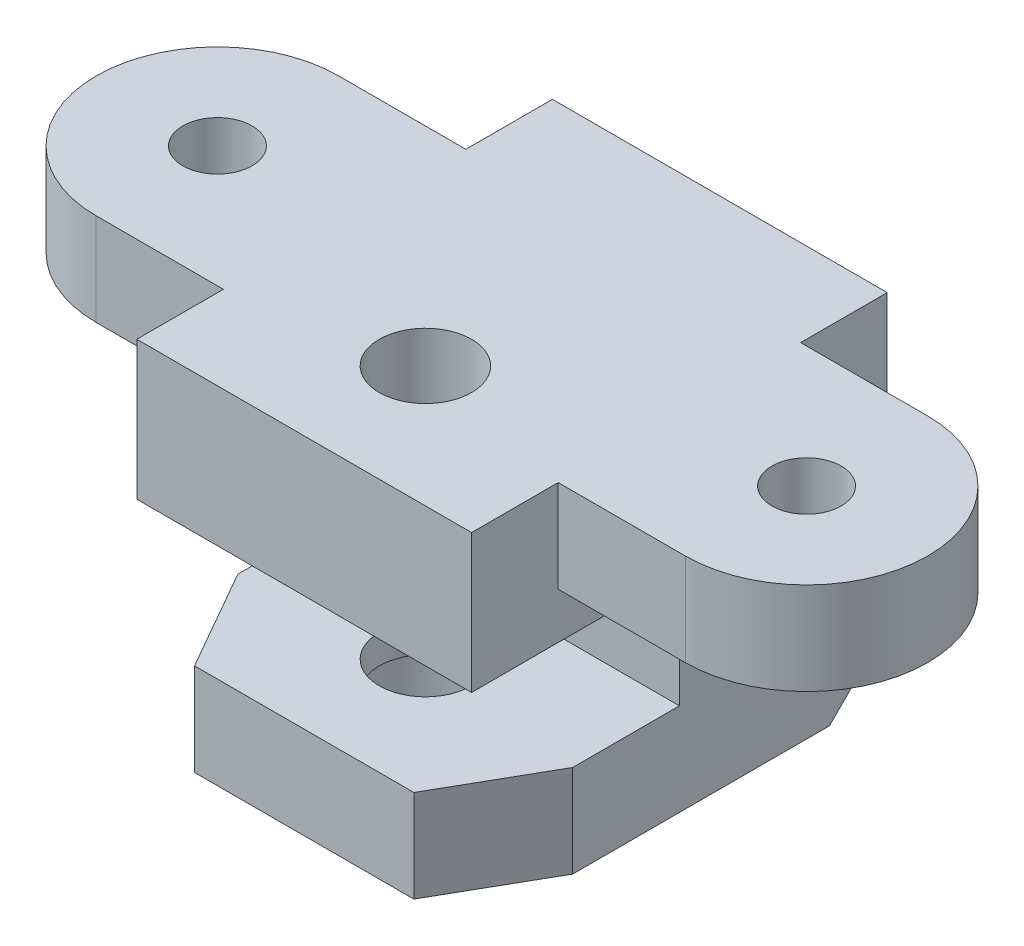
ISO-10303-21;
HEADER;
FILE_DESCRIPTION(('STEP AP214'),'2;1');
FILE_NAME('part.step','',(''),(''),'','','');
FILE_SCHEMA(('AUTOMOTIVE_DESIGN { 1 0 10303 214 1 1 1 1 }'));
ENDSEC;
DATA;
#1=APPLICATION_CONTEXT('core data for automotive mechanical design processes');
#2=APPLICATION_PROTOCOL_DEFINITION('international standard','automotive_design',2000,#1);
#3=PRODUCT_CONTEXT('',#1,'mechanical');
#4=PRODUCT('Part','Part','',(#3));
#5=PRODUCT_RELATED_PRODUCT_CATEGORY('part','',(#4));
#6=PRODUCT_DEFINITION_FORMATION('','',#4);
#7=PRODUCT_DEFINITION_CONTEXT('part definition',#1,'design');
#8=PRODUCT_DEFINITION('design','',#6,#7);
#9=PRODUCT_DEFINITION_SHAPE('','',#8);
#10=(LENGTH_UNIT() NAMED_UNIT(*) SI_UNIT(.MILLI.,.METRE.));
#11=(NAMED_UNIT(*) PLANE_ANGLE_UNIT() SI_UNIT($,.RADIAN.));
#12=(NAMED_UNIT(*) SI_UNIT($,.STERADIAN.) SOLID_ANGLE_UNIT());
#13=UNCERTAINTY_MEASURE_WITH_UNIT(LENGTH_MEASURE(1.E-05),#10,'distance_accuracy_value','');
#14=(GEOMETRIC_REPRESENTATION_CONTEXT(3) GLOBAL_UNCERTAINTY_ASSIGNED_CONTEXT((#13)) GLOBAL_UNIT_ASSIGNED_CONTEXT((#10,
#11,#12)) REPRESENTATION_CONTEXT('',''));
#15=CARTESIAN_POINT('',(0.,0.,0.));
#16=DIRECTION('',(0.,0.,1.));
#17=DIRECTION('',(1.,0.,0.));
#18=AXIS2_PLACEMENT_3D('',#15,#16,#17);
#19=CARTESIAN_POINT('',(0.,-120.,30.));
#20=DIRECTION('',(0.,1.,0.));
#21=DIRECTION('',(0.,0.,1.));
#22=AXIS2_PLACEMENT_3D('',#19,#20,#21);
#23=CYLINDRICAL_SURFACE('',#22,16.);
#24=CARTESIAN_POINT('',(0.,-88.,30.));
#25=DIRECTION('',(0.,-1.,0.));
#26=DIRECTION('',(0.,0.,-1.));
#27=AXIS2_PLACEMENT_3D('',#24,#25,#26);
#28=CIRCLE('',#27,16.);
#29=CARTESIAN_POINT('',(0.,-88.,14.));
#30=VERTEX_POINT('',#29);
#31=EDGE_CURVE('E195',#30,#30,#28,.T.);
#32=ORIENTED_EDGE('',*,*,#31,.F.);
#33=EDGE_LOOP('',(#32));
#34=FACE_BOUND('',#33,.T.);
#35=CARTESIAN_POINT('',(0.,-98.,30.));
#36=DIRECTION('',(0.,-1.,0.));
#37=DIRECTION('',(0.,0.,-1.));
#38=AXIS2_PLACEMENT_3D('',#35,#36,#37);
#39=CIRCLE('',#38,16.);
#40=CARTESIAN_POINT('',(0.,-98.,14.));
#41=VERTEX_POINT('',#40);
#42=EDGE_CURVE('E49',#41,#41,#39,.F.);
#43=ORIENTED_EDGE('',*,*,#42,.F.);
#44=EDGE_LOOP('',(#43));
#45=FACE_BOUND('',#44,.T.);
#46=ADVANCED_FACE('F45',(#34,#45),#23,.F.);
#47=CARTESIAN_POINT('',(-58.,-120.,72.));
#48=DIRECTION('',(0.,0.,1.));
#49=DIRECTION('',(1.,0.,0.));
#50=AXIS2_PLACEMENT_3D('',#47,#48,#49);
#51=PLANE('',#50);
#52=DIRECTION('',(1.,0.,0.));
#53=VECTOR('',#52,1.);
#54=CARTESIAN_POINT('',(-58.,-120.,72.));
#55=LINE('',#54,#53);
#56=CARTESIAN_POINT('',(-38.,-120.,72.));
#57=VERTEX_POINT('',#56);
#58=CARTESIAN_POINT('',(38.,-120.,72.));
#59=VERTEX_POINT('',#58);
#60=EDGE_CURVE('E412',#57,#59,#55,.T.);
#61=ORIENTED_EDGE('',*,*,#60,.T.);
#62=DIRECTION('',(0.,-1.,0.));
#63=VECTOR('',#62,1.);
#64=CARTESIAN_POINT('',(38.,0.001000000000001,72.));
#65=LINE('',#64,#63);
#66=CARTESIAN_POINT('',(38.,-88.,72.));
#67=VERTEX_POINT('',#66);
#68=EDGE_CURVE('E184',#67,#59,#65,.T.);
#69=ORIENTED_EDGE('',*,*,#68,.F.);
#70=DIRECTION('',(-1.,0.,0.));
#71=VECTOR('',#70,1.);
#72=CARTESIAN_POINT('',(58.,-88.,72.));
#73=LINE('',#72,#71);
#74=CARTESIAN_POINT('',(-38.,-88.,72.));
#75=VERTEX_POINT('',#74);
#76=EDGE_CURVE('E355',#67,#75,#73,.T.);
#77=ORIENTED_EDGE('',*,*,#76,.T.);
#78=DIRECTION('',(0.,-1.,0.));
#79=VECTOR('',#78,1.);
#80=CARTESIAN_POINT('',(-38.,0.001000000000001,72.));
#81=LINE('',#80,#79);
#82=EDGE_CURVE('E324',#75,#57,#81,.T.);
#83=ORIENTED_EDGE('',*,*,#82,.T.);
#84=EDGE_LOOP('',(#61,#69,#77,#83));
#85=FACE_BOUND('',#84,.T.);
#86=ADVANCED_FACE('F494',(#85),#51,.T.);
#87=CARTESIAN_POINT('',(58.,-120.,72.));
#88=DIRECTION('',(1.,0.,0.));
#89=DIRECTION('',(0.,0.,-1.));
#90=AXIS2_PLACEMENT_3D('',#87,#88,#89);
#91=PLANE('',#90);
#92=DIRECTION('',(0.,0.707106781186548,-0.707106781186548));
#93=VECTOR('',#92,1.);
#94=CARTESIAN_POINT('',(58.,-100.,-72.));
#95=LINE('',#94,#93);
#96=CARTESIAN_POINT('',(58.,-120.,-52.));
#97=VERTEX_POINT('',#96);
#98=CARTESIAN_POINT('',(58.,-100.,-72.));
#99=VERTEX_POINT('',#98);
#100=EDGE_CURVE('E178',#97,#99,#95,.T.);
#101=ORIENTED_EDGE('',*,*,#100,.T.);
#102=DIRECTION('',(0.,1.,0.));
#103=VECTOR('',#102,1.);
#104=CARTESIAN_POINT('',(58.,-120.,-72.));
#105=LINE('',#104,#103);
#106=CARTESIAN_POINT('',(58.,0.,-72.));
#107=VERTEX_POINT('',#106);
#108=EDGE_CURVE('E11',#99,#107,#105,.T.);
#109=ORIENTED_EDGE('',*,*,#108,.T.);
#110=DIRECTION('',(0.,0.,-1.));
#111=VECTOR('',#110,1.);
#112=CARTESIAN_POINT('',(58.,0.,72.));
#113=LINE('',#112,#111);
#114=CARTESIAN_POINT('',(58.,0.,-42.));
#115=VERTEX_POINT('',#114);
#116=EDGE_CURVE('E205',#115,#107,#113,.T.);
#117=ORIENTED_EDGE('',*,*,#116,.F.);
#118=DIRECTION('',(0.,1.,0.));
#119=VECTOR('',#118,1.);
#120=CARTESIAN_POINT('',(58.,-32.,-42.));
#121=LINE('',#120,#119);
#122=CARTESIAN_POINT('',(58.,-32.,-42.));
#123=VERTEX_POINT('',#122);
#124=EDGE_CURVE('E302',#123,#115,#121,.T.);
#125=ORIENTED_EDGE('',*,*,#124,.F.);
#126=DIRECTION('',(0.,0.,-1.));
#127=VECTOR('',#126,1.);
#128=CARTESIAN_POINT('',(58.,-32.,-42.));
#129=LINE('',#128,#127);
#130=CARTESIAN_POINT('',(58.,-32.,42.));
#131=VERTEX_POINT('',#130);
#132=EDGE_CURVE('E280',#131,#123,#129,.T.);
#133=ORIENTED_EDGE('',*,*,#132,.F.);
#134=DIRECTION('',(0.,1.,0.));
#135=VECTOR('',#134,1.);
#136=CARTESIAN_POINT('',(58.,-32.,42.));
#137=LINE('',#136,#135);
#138=CARTESIAN_POINT('',(58.,0.,42.));
#139=VERTEX_POINT('',#138);
#140=EDGE_CURVE('E294',#131,#139,#137,.T.);
#141=ORIENTED_EDGE('',*,*,#140,.T.);
#142=CARTESIAN_POINT('',(58.,0.,72.));
#143=VERTEX_POINT('',#142);
#144=EDGE_CURVE('E210',#143,#139,#113,.T.);
#145=ORIENTED_EDGE('',*,*,#144,.F.);
#146=DIRECTION('',(0.,1.,0.));
#147=VECTOR('',#146,1.);
#148=CARTESIAN_POINT('',(58.,-120.,72.));
#149=LINE('',#148,#147);
#150=CARTESIAN_POINT('',(58.,-48.,72.));
#151=VERTEX_POINT('',#150);
#152=EDGE_CURVE('E55',#151,#143,#149,.T.);
#153=ORIENTED_EDGE('',*,*,#152,.F.);
#154=DIRECTION('',(0.,0.,-1.));
#155=VECTOR('',#154,1.);
#156=CARTESIAN_POINT('',(58.,-48.,72.));
#157=LINE('',#156,#155);
#158=CARTESIAN_POINT('',(58.,-48.,0.));
#159=VERTEX_POINT('',#158);
#160=EDGE_CURVE('E331',#151,#159,#157,.T.);
#161=ORIENTED_EDGE('',*,*,#160,.T.);
#162=DIRECTION('',(0.,-1.,0.));
#163=VECTOR('',#162,1.);
#164=CARTESIAN_POINT('',(58.,-48.,0.));
#165=LINE('',#164,#163);
#166=CARTESIAN_POINT('',(58.,-88.,0.));
#167=VERTEX_POINT('',#166);
#168=EDGE_CURVE('E335',#159,#167,#165,.T.);
#169=ORIENTED_EDGE('',*,*,#168,.T.);
#170=DIRECTION('',(0.,0.,1.));
#171=VECTOR('',#170,1.);
#172=CARTESIAN_POINT('',(58.,-88.,0.));
#173=LINE('',#172,#171);
#174=CARTESIAN_POINT('',(58.,-88.,37.));
#175=VERTEX_POINT('',#174);
#176=EDGE_CURVE('E340',#167,#175,#173,.T.);
#177=ORIENTED_EDGE('',*,*,#176,.T.);
#178=DIRECTION('',(0.,-1.,0.));
#179=VECTOR('',#178,1.);
#180=CARTESIAN_POINT('',(58.,0.001000000000001,37.));
#181=LINE('',#180,#179);
#182=CARTESIAN_POINT('',(58.,-120.,37.));
#183=VERTEX_POINT('',#182);
#184=EDGE_CURVE('E71',#175,#183,#181,.T.);
#185=ORIENTED_EDGE('',*,*,#184,.T.);
#186=DIRECTION('',(0.,0.,-1.));
#187=VECTOR('',#186,1.);
#188=CARTESIAN_POINT('',(58.,-120.,72.));
#189=LINE('',#188,#187);
#190=EDGE_CURVE('E193',#183,#97,#189,.T.);
#191=ORIENTED_EDGE('',*,*,#190,.T.);
#192=EDGE_LOOP('',(#101,#109,#117,#125,#133,#141,#145,#153,#161,#169,#177,#185,#191));
#193=FACE_BOUND('',#192,.T.);
#194=ADVANCED_FACE('F189',(#193),#91,.T.);
#195=CARTESIAN_POINT('',(0.,-120.,0.));
#196=DIRECTION('',(0.,1.,0.));
#197=DIRECTION('',(0.,0.,1.));
#198=AXIS2_PLACEMENT_3D('',#195,#196,#197);
#199=PLANE('',#198);
#200=CARTESIAN_POINT('',(0.,-120.,30.));
#201=DIRECTION('',(0.,-1.,0.));
#202=DIRECTION('',(0.,0.,-1.));
#203=AXIS2_PLACEMENT_3D('',#200,#201,#202);
#204=CIRCLE('',#203,27.);
#205=CARTESIAN_POINT('',(0.,-120.,2.99999999999999));
#206=VERTEX_POINT('',#205);
#207=EDGE_CURVE('E253',#206,#206,#204,.T.);
#208=ORIENTED_EDGE('',*,*,#207,.F.);
#209=EDGE_LOOP('',(#208));
#210=FACE_BOUND('',#209,.T.);
#211=DIRECTION('',(0.,0.,-1.));
#212=VECTOR('',#211,1.);
#213=CARTESIAN_POINT('',(-58.,-120.,72.));
#214=LINE('',#213,#212);
#215=CARTESIAN_POINT('',(-58.,-120.,37.));
#216=VERTEX_POINT('',#215);
#217=CARTESIAN_POINT('',(-58.,-120.,-52.));
#218=VERTEX_POINT('',#217);
#219=EDGE_CURVE('E215',#216,#218,#214,.T.);
#220=ORIENTED_EDGE('',*,*,#219,.T.);
#221=DIRECTION('',(-1.,0.,0.));
#222=VECTOR('',#221,1.);
#223=CARTESIAN_POINT('',(144.070345964171,-120.,-52.));
#224=LINE('',#223,#222);
#225=EDGE_CURVE('E185',#97,#218,#224,.T.);
#226=ORIENTED_EDGE('',*,*,#225,.F.);
#227=ORIENTED_EDGE('',*,*,#190,.F.);
#228=DIRECTION('',(-0.496138938356834,0.,0.868243142124459));
#229=VECTOR('',#228,1.);
#230=CARTESIAN_POINT('',(38.,-120.,72.));
#231=LINE('',#230,#229);
#232=EDGE_CURVE('E263',#183,#59,#231,.T.);
#233=ORIENTED_EDGE('',*,*,#232,.T.);
#234=ORIENTED_EDGE('',*,*,#60,.F.);
#235=DIRECTION('',(0.496138938356834,0.,0.868243142124459));
#236=VECTOR('',#235,1.);
#237=CARTESIAN_POINT('',(-38.,-120.,72.));
#238=LINE('',#237,#236);
#239=EDGE_CURVE('E320',#216,#57,#238,.T.);
#240=ORIENTED_EDGE('',*,*,#239,.F.);
#241=EDGE_LOOP('',(#220,#226,#227,#233,#234,#240));
#242=FACE_BOUND('',#241,.T.);
#243=ADVANCED_FACE('F423',(#210,#242),#199,.F.);
#244=CARTESIAN_POINT('',(58.,-88.,0.));
#245=DIRECTION('',(0.,-1.,0.));
#246=DIRECTION('',(0.,0.,-1.));
#247=AXIS2_PLACEMENT_3D('',#244,#245,#246);
#248=PLANE('',#247);
#249=ORIENTED_EDGE('',*,*,#31,.T.);
#250=EDGE_LOOP('',(#249));
#251=FACE_BOUND('',#250,.T.);
#252=DIRECTION('',(0.496138938356834,0.,-0.868243142124459));
#253=VECTOR('',#252,1.);
#254=CARTESIAN_POINT('',(38.,-88.,72.));
#255=LINE('',#254,#253);
#256=EDGE_CURVE('E260',#67,#175,#255,.T.);
#257=ORIENTED_EDGE('',*,*,#256,.T.);
#258=ORIENTED_EDGE('',*,*,#176,.F.);
#259=DIRECTION('',(-1.,0.,0.));
#260=VECTOR('',#259,1.);
#261=CARTESIAN_POINT('',(58.,-88.,0.));
#262=LINE('',#261,#260);
#263=CARTESIAN_POINT('',(-58.,-88.,0.));
#264=VERTEX_POINT('',#263);
#265=EDGE_CURVE('E359',#167,#264,#262,.T.);
#266=ORIENTED_EDGE('',*,*,#265,.T.);
#267=DIRECTION('',(0.,0.,1.));
#268=VECTOR('',#267,1.);
#269=CARTESIAN_POINT('',(-58.,-88.,0.));
#270=LINE('',#269,#268);
#271=CARTESIAN_POINT('',(-58.,-88.,37.));
#272=VERTEX_POINT('',#271);
#273=EDGE_CURVE('E336',#264,#272,#270,.T.);
#274=ORIENTED_EDGE('',*,*,#273,.T.);
#275=DIRECTION('',(-0.496138938356834,0.,-0.868243142124459));
#276=VECTOR('',#275,1.);
#277=CARTESIAN_POINT('',(-38.,-88.,72.));
#278=LINE('',#277,#276);
#279=EDGE_CURVE('E306',#75,#272,#278,.T.);
#280=ORIENTED_EDGE('',*,*,#279,.F.);
#281=ORIENTED_EDGE('',*,*,#76,.F.);
#282=EDGE_LOOP('',(#257,#258,#266,#274,#280,#281));
#283=FACE_BOUND('',#282,.T.);
#284=ADVANCED_FACE('F535',(#251,#283),#248,.F.);
#285=CARTESIAN_POINT('',(-58.,-120.,72.));
#286=DIRECTION('',(1.,0.,0.));
#287=DIRECTION('',(0.,0.,-1.));
#288=AXIS2_PLACEMENT_3D('',#285,#286,#287);
#289=PLANE('',#288);
#290=DIRECTION('',(0.,1.,0.));
#291=VECTOR('',#290,1.);
#292=CARTESIAN_POINT('',(-58.,-120.,-72.));
#293=LINE('',#292,#291);
#294=CARTESIAN_POINT('',(-58.,-100.,-72.));
#295=VERTEX_POINT('',#294);
#296=CARTESIAN_POINT('',(-58.,0.,-72.));
#297=VERTEX_POINT('',#296);
#298=EDGE_CURVE('E200',#295,#297,#293,.T.);
#299=ORIENTED_EDGE('',*,*,#298,.F.);
#300=DIRECTION('',(0.,0.707106781186548,-0.707106781186548));
#301=VECTOR('',#300,1.);
#302=CARTESIAN_POINT('',(-58.,-100.,-72.));
#303=LINE('',#302,#301);
#304=EDGE_CURVE('E63',#218,#295,#303,.T.);
#305=ORIENTED_EDGE('',*,*,#304,.F.);
#306=ORIENTED_EDGE('',*,*,#219,.F.);
#307=DIRECTION('',(0.,-1.,0.));
#308=VECTOR('',#307,1.);
#309=CARTESIAN_POINT('',(-58.,0.001000000000001,37.));
#310=LINE('',#309,#308);
#311=EDGE_CURVE('E323',#272,#216,#310,.T.);
#312=ORIENTED_EDGE('',*,*,#311,.F.);
#313=ORIENTED_EDGE('',*,*,#273,.F.);
#314=DIRECTION('',(0.,-1.,0.));
#315=VECTOR('',#314,1.);
#316=CARTESIAN_POINT('',(-58.,-48.,0.));
#317=LINE('',#316,#315);
#318=CARTESIAN_POINT('',(-58.,-48.,0.));
#319=VERTEX_POINT('',#318);
#320=EDGE_CURVE('E348',#319,#264,#317,.T.);
#321=ORIENTED_EDGE('',*,*,#320,.F.);
#322=DIRECTION('',(0.,0.,-1.));
#323=VECTOR('',#322,1.);
#324=CARTESIAN_POINT('',(-58.,-48.,72.));
#325=LINE('',#324,#323);
#326=CARTESIAN_POINT('',(-58.,-48.,72.));
#327=VERTEX_POINT('',#326);
#328=EDGE_CURVE('E328',#327,#319,#325,.T.);
#329=ORIENTED_EDGE('',*,*,#328,.F.);
#330=DIRECTION('',(0.,1.,0.));
#331=VECTOR('',#330,1.);
#332=CARTESIAN_POINT('',(-58.,-120.,72.));
#333=LINE('',#332,#331);
#334=CARTESIAN_POINT('',(-58.,0.,72.));
#335=VERTEX_POINT('',#334);
#336=EDGE_CURVE('E231',#327,#335,#333,.T.);
#337=ORIENTED_EDGE('',*,*,#336,.T.);
#338=DIRECTION('',(0.,0.,-1.));
#339=VECTOR('',#338,1.);
#340=CARTESIAN_POINT('',(-58.,0.,72.));
#341=LINE('',#340,#339);
#342=CARTESIAN_POINT('',(-58.,0.,42.));
#343=VERTEX_POINT('',#342);
#344=EDGE_CURVE('E225',#335,#343,#341,.T.);
#345=ORIENTED_EDGE('',*,*,#344,.T.);
#346=DIRECTION('',(0.,1.,0.));
#347=VECTOR('',#346,1.);
#348=CARTESIAN_POINT('',(-58.,-32.,42.));
#349=LINE('',#348,#347);
#350=CARTESIAN_POINT('',(-58.,-32.,42.));
#351=VERTEX_POINT('',#350);
#352=EDGE_CURVE('E206',#351,#343,#349,.T.);
#353=ORIENTED_EDGE('',*,*,#352,.F.);
#354=DIRECTION('',(0.,0.,-1.));
#355=VECTOR('',#354,1.);
#356=CARTESIAN_POINT('',(-58.,-32.,-42.));
#357=LINE('',#356,#355);
#358=CARTESIAN_POINT('',(-58.,-32.,-42.));
#359=VERTEX_POINT('',#358);
#360=EDGE_CURVE('E375',#351,#359,#357,.T.);
#361=ORIENTED_EDGE('',*,*,#360,.T.);
#362=DIRECTION('',(0.,1.,0.));
#363=VECTOR('',#362,1.);
#364=CARTESIAN_POINT('',(-58.,-32.,-42.));
#365=LINE('',#364,#363);
#366=CARTESIAN_POINT('',(-58.,0.,-42.));
#367=VERTEX_POINT('',#366);
#368=EDGE_CURVE('E392',#359,#367,#365,.T.);
#369=ORIENTED_EDGE('',*,*,#368,.T.);
#370=EDGE_CURVE('E224',#367,#297,#341,.T.);
#371=ORIENTED_EDGE('',*,*,#370,.T.);
#372=EDGE_LOOP('',(#299,#305,#306,#312,#313,#321,#329,#337,#345,#353,#361,#369,#371));
#373=FACE_BOUND('',#372,.T.);
#374=ADVANCED_FACE('F426',(#373),#289,.F.);
#375=CARTESIAN_POINT('',(-58.,-120.,-72.));
#376=DIRECTION('',(0.,0.,1.));
#377=DIRECTION('',(1.,0.,0.));
#378=AXIS2_PLACEMENT_3D('',#375,#376,#377);
#379=PLANE('',#378);
#380=ORIENTED_EDGE('',*,*,#108,.F.);
#381=DIRECTION('',(-1.,0.,0.));
#382=VECTOR('',#381,1.);
#383=CARTESIAN_POINT('',(144.070345964171,-100.,-72.));
#384=LINE('',#383,#382);
#385=EDGE_CURVE('E175',#99,#295,#384,.T.);
#386=ORIENTED_EDGE('',*,*,#385,.T.);
#387=ORIENTED_EDGE('',*,*,#298,.T.);
#388=DIRECTION('',(1.,0.,0.));
#389=VECTOR('',#388,1.);
#390=CARTESIAN_POINT('',(-58.,0.,-72.));
#391=LINE('',#390,#389);
#392=EDGE_CURVE('E199',#297,#107,#391,.T.);
#393=ORIENTED_EDGE('',*,*,#392,.T.);
#394=EDGE_LOOP('',(#380,#386,#387,#393));
#395=FACE_BOUND('',#394,.T.);
#396=ADVANCED_FACE('F47',(#395),#379,.F.);
#397=DIRECTION('',(-1.,0.,0.));
#398=VECTOR('',#397,1.);
#399=CARTESIAN_POINT('',(58.,-48.,72.));
#400=LINE('',#399,#398);
#401=EDGE_CURVE('E344',#151,#327,#400,.T.);
#402=ORIENTED_EDGE('',*,*,#401,.F.);
#403=ORIENTED_EDGE('',*,*,#152,.T.);
#404=DIRECTION('',(1.,0.,0.));
#405=VECTOR('',#404,1.);
#406=CARTESIAN_POINT('',(-58.,0.,72.));
#407=LINE('',#406,#405);
#408=EDGE_CURVE('E220',#335,#143,#407,.T.);
#409=ORIENTED_EDGE('',*,*,#408,.F.);
#410=ORIENTED_EDGE('',*,*,#336,.F.);
#411=EDGE_LOOP('',(#402,#403,#409,#410));
#412=FACE_BOUND('',#411,.T.);
#413=ADVANCED_FACE('F450',(#412),#51,.T.);
#414=CARTESIAN_POINT('',(0.,0.,0.));
#415=DIRECTION('',(0.,1.,0.));
#416=DIRECTION('',(0.,0.,1.));
#417=AXIS2_PLACEMENT_3D('',#414,#415,#416);
#418=PLANE('',#417);
#419=CARTESIAN_POINT('',(0.,0.,30.));
#420=DIRECTION('',(0.,1.,0.));
#421=DIRECTION('',(0.,0.,1.));
#422=AXIS2_PLACEMENT_3D('',#419,#420,#421);
#423=CIRCLE('',#422,16.);
#424=CARTESIAN_POINT('',(0.,0.,46.));
#425=VERTEX_POINT('',#424);
#426=EDGE_CURVE('E238',#425,#425,#423,.T.);
#427=ORIENTED_EDGE('',*,*,#426,.F.);
#428=EDGE_LOOP('',(#427));
#429=FACE_BOUND('',#428,.T.);
#430=ORIENTED_EDGE('',*,*,#392,.F.);
#431=ORIENTED_EDGE('',*,*,#370,.F.);
#432=DIRECTION('',(-1.,0.,0.));
#433=VECTOR('',#432,1.);
#434=CARTESIAN_POINT('',(-58.,0.,-42.));
#435=LINE('',#434,#433);
#436=CARTESIAN_POINT('',(-102.069345964171,0.,-42.));
#437=VERTEX_POINT('',#436);
#438=EDGE_CURVE('E371',#367,#437,#435,.T.);
#439=ORIENTED_EDGE('',*,*,#438,.T.);
#440=CARTESIAN_POINT('',(-102.069345964171,0.,0.));
#441=DIRECTION('',(0.,1.,0.));
#442=DIRECTION('',(0.,0.,1.));
#443=AXIS2_PLACEMENT_3D('',#440,#441,#442);
#444=CIRCLE('',#443,42.);
#445=CARTESIAN_POINT('',(-102.069345964171,0.,42.));
#446=VERTEX_POINT('',#445);
#447=EDGE_CURVE('E396',#437,#446,#444,.T.);
#448=ORIENTED_EDGE('',*,*,#447,.T.);
#449=DIRECTION('',(1.,0.,0.));
#450=VECTOR('',#449,1.);
#451=CARTESIAN_POINT('',(-102.069345964171,0.,42.));
#452=LINE('',#451,#450);
#453=EDGE_CURVE('E380',#446,#343,#452,.T.);
#454=ORIENTED_EDGE('',*,*,#453,.T.);
#455=ORIENTED_EDGE('',*,*,#344,.F.);
#456=ORIENTED_EDGE('',*,*,#408,.T.);
#457=ORIENTED_EDGE('',*,*,#144,.T.);
#458=DIRECTION('',(-1.,0.,0.));
#459=VECTOR('',#458,1.);
#460=CARTESIAN_POINT('',(102.069345964171,0.,42.));
#461=LINE('',#460,#459);
#462=CARTESIAN_POINT('',(102.069345964171,0.,42.));
#463=VERTEX_POINT('',#462);
#464=EDGE_CURVE('E276',#463,#139,#461,.T.);
#465=ORIENTED_EDGE('',*,*,#464,.F.);
#466=CARTESIAN_POINT('',(102.069345964171,0.,0.));
#467=DIRECTION('',(0.,-1.,0.));
#468=DIRECTION('',(0.,0.,1.));
#469=AXIS2_PLACEMENT_3D('',#466,#467,#468);
#470=CIRCLE('',#469,42.);
#471=CARTESIAN_POINT('',(102.069345964171,0.,-42.));
#472=VERTEX_POINT('',#471);
#473=EDGE_CURVE('E297',#472,#463,#470,.T.);
#474=ORIENTED_EDGE('',*,*,#473,.F.);
#475=DIRECTION('',(1.,0.,0.));
#476=VECTOR('',#475,1.);
#477=CARTESIAN_POINT('',(58.,0.,-42.));
#478=LINE('',#477,#476);
#479=EDGE_CURVE('E285',#115,#472,#478,.T.);
#480=ORIENTED_EDGE('',*,*,#479,.F.);
#481=ORIENTED_EDGE('',*,*,#116,.T.);
#482=EDGE_LOOP('',(#430,#431,#439,#448,#454,#455,#456,#457,#465,#474,#480,#481));
#483=FACE_BOUND('',#482,.T.);
#484=CARTESIAN_POINT('',(-102.069345964171,0.,0.));
#485=DIRECTION('',(0.,1.,0.));
#486=DIRECTION('',(0.,0.,1.));
#487=AXIS2_PLACEMENT_3D('',#484,#485,#486);
#488=CIRCLE('',#487,12.);
#489=CARTESIAN_POINT('',(-102.069345964171,0.,12.));
#490=VERTEX_POINT('',#489);
#491=EDGE_CURVE('E358',#490,#490,#488,.T.);
#492=ORIENTED_EDGE('',*,*,#491,.F.);
#493=EDGE_LOOP('',(#492));
#494=FACE_BOUND('',#493,.T.);
#495=CARTESIAN_POINT('',(102.069345964171,0.,0.));
#496=DIRECTION('',(0.,-1.,0.));
#497=DIRECTION('',(0.,0.,1.));
#498=AXIS2_PLACEMENT_3D('',#495,#496,#497);
#499=CIRCLE('',#498,12.);
#500=CARTESIAN_POINT('',(102.069345964171,0.,12.));
#501=VERTEX_POINT('',#500);
#502=EDGE_CURVE('E267',#501,#501,#499,.T.);
#503=ORIENTED_EDGE('',*,*,#502,.T.);
#504=EDGE_LOOP('',(#503));
#505=FACE_BOUND('',#504,.T.);
#506=ADVANCED_FACE('F429',(#429,#483,#494,#505),#418,.T.);
#507=CARTESIAN_POINT('',(-102.069345964171,-32.,42.));
#508=DIRECTION('',(0.,0.,1.));
#509=DIRECTION('',(1.,0.,0.));
#510=AXIS2_PLACEMENT_3D('',#507,#508,#509);
#511=PLANE('',#510);
#512=ORIENTED_EDGE('',*,*,#453,.F.);
#513=DIRECTION('',(0.,1.,0.));
#514=VECTOR('',#513,1.);
#515=CARTESIAN_POINT('',(-102.069345964171,-32.,42.));
#516=LINE('',#515,#514);
#517=CARTESIAN_POINT('',(-102.069345964171,-32.,42.));
#518=VERTEX_POINT('',#517);
#519=EDGE_CURVE('E212',#518,#446,#516,.T.);
#520=ORIENTED_EDGE('',*,*,#519,.F.);
#521=DIRECTION('',(1.,0.,0.));
#522=VECTOR('',#521,1.);
#523=CARTESIAN_POINT('',(-102.069345964171,-32.,42.));
#524=LINE('',#523,#522);
#525=EDGE_CURVE('E388',#518,#351,#524,.T.);
#526=ORIENTED_EDGE('',*,*,#525,.T.);
#527=ORIENTED_EDGE('',*,*,#352,.T.);
#528=EDGE_LOOP('',(#512,#520,#526,#527));
#529=FACE_BOUND('',#528,.T.);
#530=ADVANCED_FACE('F441',(#529),#511,.T.);
#531=CARTESIAN_POINT('',(-102.069345964171,-32.,0.));
#532=DIRECTION('',(0.,1.,0.));
#533=DIRECTION('',(0.,0.,1.));
#534=AXIS2_PLACEMENT_3D('',#531,#532,#533);
#535=CYLINDRICAL_SURFACE('',#534,42.);
#536=ORIENTED_EDGE('',*,*,#447,.F.);
#537=DIRECTION('',(0.,1.,0.));
#538=VECTOR('',#537,1.);
#539=CARTESIAN_POINT('',(-102.069345964171,-32.,-42.));
#540=LINE('',#539,#538);
#541=CARTESIAN_POINT('',(-102.069345964171,-32.,-42.));
#542=VERTEX_POINT('',#541);
#543=EDGE_CURVE('E405',#542,#437,#540,.T.);
#544=ORIENTED_EDGE('',*,*,#543,.F.);
#545=CARTESIAN_POINT('',(-102.069345964171,-32.,0.));
#546=DIRECTION('',(0.,1.,0.));
#547=DIRECTION('',(0.,0.,1.));
#548=AXIS2_PLACEMENT_3D('',#545,#546,#547);
#549=CIRCLE('',#548,42.);
#550=EDGE_CURVE('E384',#542,#518,#549,.T.);
#551=ORIENTED_EDGE('',*,*,#550,.T.);
#552=ORIENTED_EDGE('',*,*,#519,.T.);
#553=EDGE_LOOP('',(#536,#544,#551,#552));
#554=FACE_BOUND('',#553,.T.);
#555=ADVANCED_FACE('F438',(#554),#535,.T.);
#556=CARTESIAN_POINT('',(-58.,-32.,-42.));
#557=DIRECTION('',(0.,0.,-1.));
#558=DIRECTION('',(-1.,0.,0.));
#559=AXIS2_PLACEMENT_3D('',#556,#557,#558);
#560=PLANE('',#559);
#561=ORIENTED_EDGE('',*,*,#438,.F.);
#562=ORIENTED_EDGE('',*,*,#368,.F.);
#563=DIRECTION('',(-1.,0.,0.));
#564=VECTOR('',#563,1.);
#565=CARTESIAN_POINT('',(-58.,-32.,-42.));
#566=LINE('',#565,#564);
#567=EDGE_CURVE('E379',#359,#542,#566,.T.);
#568=ORIENTED_EDGE('',*,*,#567,.T.);
#569=ORIENTED_EDGE('',*,*,#543,.T.);
#570=EDGE_LOOP('',(#561,#562,#568,#569));
#571=FACE_BOUND('',#570,.T.);
#572=ADVANCED_FACE('F434',(#571),#560,.T.);
#573=CARTESIAN_POINT('',(-102.069345964171,-32.,0.));
#574=DIRECTION('',(0.,1.,0.));
#575=DIRECTION('',(0.,0.,1.));
#576=AXIS2_PLACEMENT_3D('',#573,#574,#575);
#577=PLANE('',#576);
#578=CARTESIAN_POINT('',(-102.069345964171,-32.,0.));
#579=DIRECTION('',(0.,1.,0.));
#580=DIRECTION('',(0.,0.,1.));
#581=AXIS2_PLACEMENT_3D('',#578,#579,#580);
#582=CIRCLE('',#581,12.);
#583=CARTESIAN_POINT('',(-102.069345964171,-32.,12.));
#584=VERTEX_POINT('',#583);
#585=EDGE_CURVE('E367',#584,#584,#582,.T.);
#586=ORIENTED_EDGE('',*,*,#585,.T.);
#587=EDGE_LOOP('',(#586));
#588=FACE_BOUND('',#587,.T.);
#589=ORIENTED_EDGE('',*,*,#360,.F.);
#590=ORIENTED_EDGE('',*,*,#525,.F.);
#591=ORIENTED_EDGE('',*,*,#550,.F.);
#592=ORIENTED_EDGE('',*,*,#567,.F.);
#593=EDGE_LOOP('',(#589,#590,#591,#592));
#594=FACE_BOUND('',#593,.T.);
#595=ADVANCED_FACE('F546',(#588,#594),#577,.F.);
#596=CARTESIAN_POINT('',(-102.069345964171,-32.,0.));
#597=DIRECTION('',(0.,1.,0.));
#598=DIRECTION('',(0.,0.,1.));
#599=AXIS2_PLACEMENT_3D('',#596,#597,#598);
#600=CYLINDRICAL_SURFACE('',#599,12.);
#601=ORIENTED_EDGE('',*,*,#585,.F.);
#602=EDGE_LOOP('',(#601));
#603=FACE_BOUND('',#602,.T.);
#604=ORIENTED_EDGE('',*,*,#491,.T.);
#605=EDGE_LOOP('',(#604));
#606=FACE_BOUND('',#605,.T.);
#607=ADVANCED_FACE('F541',(#603,#606),#600,.F.);
#608=CARTESIAN_POINT('',(58.,-48.,0.));
#609=DIRECTION('',(0.,0.,-1.));
#610=DIRECTION('',(0.,1.,0.));
#611=AXIS2_PLACEMENT_3D('',#608,#609,#610);
#612=PLANE('',#611);
#613=ORIENTED_EDGE('',*,*,#320,.T.);
#614=ORIENTED_EDGE('',*,*,#265,.F.);
#615=ORIENTED_EDGE('',*,*,#168,.F.);
#616=DIRECTION('',(-1.,0.,0.));
#617=VECTOR('',#616,1.);
#618=CARTESIAN_POINT('',(58.,-48.,0.));
#619=LINE('',#618,#617);
#620=EDGE_CURVE('E362',#159,#319,#619,.T.);
#621=ORIENTED_EDGE('',*,*,#620,.T.);
#622=EDGE_LOOP('',(#613,#614,#615,#621));
#623=FACE_BOUND('',#622,.T.);
#624=ADVANCED_FACE('F538',(#623),#612,.F.);
#625=CARTESIAN_POINT('',(58.,-48.,72.));
#626=DIRECTION('',(0.,1.,0.));
#627=DIRECTION('',(0.,0.,1.));
#628=AXIS2_PLACEMENT_3D('',#625,#626,#627);
#629=PLANE('',#628);
#630=CARTESIAN_POINT('',(0.,-48.,30.));
#631=DIRECTION('',(0.,1.,0.));
#632=DIRECTION('',(0.,0.,1.));
#633=AXIS2_PLACEMENT_3D('',#630,#631,#632);
#634=CIRCLE('',#633,16.);
#635=CARTESIAN_POINT('',(0.,-48.,46.));
#636=VERTEX_POINT('',#635);
#637=EDGE_CURVE('E235',#636,#636,#634,.T.);
#638=ORIENTED_EDGE('',*,*,#637,.T.);
#639=EDGE_LOOP('',(#638));
#640=FACE_BOUND('',#639,.T.);
#641=ORIENTED_EDGE('',*,*,#328,.T.);
#642=ORIENTED_EDGE('',*,*,#620,.F.);
#643=ORIENTED_EDGE('',*,*,#160,.F.);
#644=ORIENTED_EDGE('',*,*,#401,.T.);
#645=EDGE_LOOP('',(#641,#642,#643,#644));
#646=FACE_BOUND('',#645,.T.);
#647=ADVANCED_FACE('F533',(#640,#646),#629,.F.);
#648=CARTESIAN_POINT('',(-38.,0.001000000000001,72.));
#649=DIRECTION('',(0.868243142124459,0.,-0.496138938356834));
#650=DIRECTION('',(-0.496138938356834,0.,-0.868243142124459));
#651=AXIS2_PLACEMENT_3D('',#648,#649,#650);
#652=PLANE('',#651);
#653=ORIENTED_EDGE('',*,*,#279,.T.);
#654=ORIENTED_EDGE('',*,*,#311,.T.);
#655=ORIENTED_EDGE('',*,*,#239,.T.);
#656=ORIENTED_EDGE('',*,*,#82,.F.);
#657=EDGE_LOOP('',(#653,#654,#655,#656));
#658=FACE_BOUND('',#657,.T.);
#659=ADVANCED_FACE('F472',(#658),#652,.F.);
#660=CARTESIAN_POINT('',(102.069345964171,-32.,0.));
#661=DIRECTION('',(0.,1.,0.));
#662=DIRECTION('',(0.,0.,1.));
#663=AXIS2_PLACEMENT_3D('',#660,#661,#662);
#664=PLANE('',#663);
#665=ORIENTED_EDGE('',*,*,#132,.T.);
#666=DIRECTION('',(1.,0.,0.));
#667=VECTOR('',#666,1.);
#668=CARTESIAN_POINT('',(58.,-32.,-42.));
#669=LINE('',#668,#667);
#670=CARTESIAN_POINT('',(102.069345964171,-32.,-42.));
#671=VERTEX_POINT('',#670);
#672=EDGE_CURVE('E291',#123,#671,#669,.T.);
#673=ORIENTED_EDGE('',*,*,#672,.T.);
#674=CARTESIAN_POINT('',(102.069345964171,-32.,0.));
#675=DIRECTION('',(0.,-1.,0.));
#676=DIRECTION('',(0.,0.,1.));
#677=AXIS2_PLACEMENT_3D('',#674,#675,#676);
#678=CIRCLE('',#677,42.);
#679=CARTESIAN_POINT('',(102.069345964171,-32.,42.));
#680=VERTEX_POINT('',#679);
#681=EDGE_CURVE('E288',#671,#680,#678,.T.);
#682=ORIENTED_EDGE('',*,*,#681,.T.);
#683=DIRECTION('',(-1.,0.,0.));
#684=VECTOR('',#683,1.);
#685=CARTESIAN_POINT('',(102.069345964171,-32.,42.));
#686=LINE('',#685,#684);
#687=EDGE_CURVE('E284',#680,#131,#686,.T.);
#688=ORIENTED_EDGE('',*,*,#687,.T.);
#689=EDGE_LOOP('',(#665,#673,#682,#688));
#690=FACE_BOUND('',#689,.T.);
#691=CARTESIAN_POINT('',(102.069345964171,-32.,0.));
#692=DIRECTION('',(0.,-1.,0.));
#693=DIRECTION('',(0.,0.,1.));
#694=AXIS2_PLACEMENT_3D('',#691,#692,#693);
#695=CIRCLE('',#694,12.);
#696=CARTESIAN_POINT('',(102.069345964171,-32.,12.));
#697=VERTEX_POINT('',#696);
#698=EDGE_CURVE('E272',#697,#697,#695,.T.);
#699=ORIENTED_EDGE('',*,*,#698,.F.);
#700=EDGE_LOOP('',(#699));
#701=FACE_BOUND('',#700,.T.);
#702=ADVANCED_FACE('F469',(#690,#701),#664,.F.);
#703=CARTESIAN_POINT('',(58.,-32.,-42.));
#704=DIRECTION('',(0.,0.,1.));
#705=DIRECTION('',(1.,0.,0.));
#706=AXIS2_PLACEMENT_3D('',#703,#704,#705);
#707=PLANE('',#706);
#708=ORIENTED_EDGE('',*,*,#479,.T.);
#709=DIRECTION('',(0.,1.,0.));
#710=VECTOR('',#709,1.);
#711=CARTESIAN_POINT('',(102.069345964171,-32.,-42.));
#712=LINE('',#711,#710);
#713=EDGE_CURVE('E307',#671,#472,#712,.T.);
#714=ORIENTED_EDGE('',*,*,#713,.F.);
#715=ORIENTED_EDGE('',*,*,#672,.F.);
#716=ORIENTED_EDGE('',*,*,#124,.T.);
#717=EDGE_LOOP('',(#708,#714,#715,#716));
#718=FACE_BOUND('',#717,.T.);
#719=ADVANCED_FACE('F467',(#718),#707,.F.);
#720=CARTESIAN_POINT('',(102.069345964171,-32.,0.));
#721=DIRECTION('',(0.,1.,0.));
#722=DIRECTION('',(0.,0.,1.));
#723=AXIS2_PLACEMENT_3D('',#720,#721,#722);
#724=CYLINDRICAL_SURFACE('',#723,42.);
#725=ORIENTED_EDGE('',*,*,#473,.T.);
#726=DIRECTION('',(0.,1.,0.));
#727=VECTOR('',#726,1.);
#728=CARTESIAN_POINT('',(102.069345964171,-32.,42.));
#729=LINE('',#728,#727);
#730=EDGE_CURVE('E311',#680,#463,#729,.T.);
#731=ORIENTED_EDGE('',*,*,#730,.F.);
#732=ORIENTED_EDGE('',*,*,#681,.F.);
#733=ORIENTED_EDGE('',*,*,#713,.T.);
#734=EDGE_LOOP('',(#725,#731,#732,#733));
#735=FACE_BOUND('',#734,.T.);
#736=ADVANCED_FACE('F464',(#735),#724,.T.);
#737=CARTESIAN_POINT('',(102.069345964171,-32.,42.));
#738=DIRECTION('',(0.,0.,-1.));
#739=DIRECTION('',(-1.,0.,0.));
#740=AXIS2_PLACEMENT_3D('',#737,#738,#739);
#741=PLANE('',#740);
#742=ORIENTED_EDGE('',*,*,#464,.T.);
#743=ORIENTED_EDGE('',*,*,#140,.F.);
#744=ORIENTED_EDGE('',*,*,#687,.F.);
#745=ORIENTED_EDGE('',*,*,#730,.T.);
#746=EDGE_LOOP('',(#742,#743,#744,#745));
#747=FACE_BOUND('',#746,.T.);
#748=ADVANCED_FACE('F460',(#747),#741,.F.);
#749=CARTESIAN_POINT('',(102.069345964171,-32.,0.));
#750=DIRECTION('',(0.,1.,0.));
#751=DIRECTION('',(0.,0.,1.));
#752=AXIS2_PLACEMENT_3D('',#749,#750,#751);
#753=CYLINDRICAL_SURFACE('',#752,12.);
#754=ORIENTED_EDGE('',*,*,#698,.T.);
#755=EDGE_LOOP('',(#754));
#756=FACE_BOUND('',#755,.T.);
#757=ORIENTED_EDGE('',*,*,#502,.F.);
#758=EDGE_LOOP('',(#757));
#759=FACE_BOUND('',#758,.T.);
#760=ADVANCED_FACE('F476',(#756,#759),#753,.F.);
#761=CARTESIAN_POINT('',(38.,0.001000000000001,72.));
#762=DIRECTION('',(0.868243142124459,0.,0.496138938356834));
#763=DIRECTION('',(0.496138938356834,0.,-0.868243142124459));
#764=AXIS2_PLACEMENT_3D('',#761,#762,#763);
#765=PLANE('',#764);
#766=ORIENTED_EDGE('',*,*,#68,.T.);
#767=ORIENTED_EDGE('',*,*,#232,.F.);
#768=ORIENTED_EDGE('',*,*,#184,.F.);
#769=ORIENTED_EDGE('',*,*,#256,.F.);
#770=EDGE_LOOP('',(#766,#767,#768,#769));
#771=FACE_BOUND('',#770,.T.);
#772=ADVANCED_FACE('F479',(#771),#765,.T.);
#773=CARTESIAN_POINT('',(144.070345964171,-100.,-72.));
#774=DIRECTION('',(0.,0.707106781186548,0.707106781186548));
#775=DIRECTION('',(0.,-0.707106781186548,0.707106781186548));
#776=AXIS2_PLACEMENT_3D('',#773,#774,#775);
#777=PLANE('',#776);
#778=ORIENTED_EDGE('',*,*,#225,.T.);
#779=ORIENTED_EDGE('',*,*,#304,.T.);
#780=ORIENTED_EDGE('',*,*,#385,.F.);
#781=ORIENTED_EDGE('',*,*,#100,.F.);
#782=EDGE_LOOP('',(#778,#779,#780,#781));
#783=FACE_BOUND('',#782,.T.);
#784=ADVANCED_FACE('F177',(#783),#777,.F.);
#785=ORIENTED_EDGE('',*,*,#426,.T.);
#786=EDGE_LOOP('',(#785));
#787=FACE_BOUND('',#786,.T.);
#788=ORIENTED_EDGE('',*,*,#637,.F.);
#789=EDGE_LOOP('',(#788));
#790=FACE_BOUND('',#789,.T.);
#791=ADVANCED_FACE('F500',(#787,#790),#23,.F.);
#792=CARTESIAN_POINT('',(0.,-98.,30.));
#793=DIRECTION('',(0.,-1.,0.));
#794=DIRECTION('',(0.,0.,-1.));
#795=AXIS2_PLACEMENT_3D('',#792,#793,#794);
#796=PLANE('',#795);
#797=CARTESIAN_POINT('',(0.,-98.,30.));
#798=DIRECTION('',(0.,-1.,0.));
#799=DIRECTION('',(0.,0.,-1.));
#800=AXIS2_PLACEMENT_3D('',#797,#798,#799);
#801=CIRCLE('',#800,27.);
#802=CARTESIAN_POINT('',(0.,-98.,2.99999999999999));
#803=VERTEX_POINT('',#802);
#804=EDGE_CURVE('E251',#803,#803,#801,.T.);
#805=ORIENTED_EDGE('',*,*,#804,.T.);
#806=EDGE_LOOP('',(#805));
#807=FACE_BOUND('',#806,.T.);
#808=ORIENTED_EDGE('',*,*,#42,.T.);
#809=EDGE_LOOP('',(#808));
#810=FACE_BOUND('',#809,.T.);
#811=ADVANCED_FACE('F510',(#807,#810),#796,.T.);
#812=CARTESIAN_POINT('',(0.,-98.,30.));
#813=DIRECTION('',(0.,-1.,0.));
#814=DIRECTION('',(0.,0.,-1.));
#815=AXIS2_PLACEMENT_3D('',#812,#813,#814);
#816=CYLINDRICAL_SURFACE('',#815,27.);
#817=ORIENTED_EDGE('',*,*,#804,.F.);
#818=EDGE_LOOP('',(#817));
#819=FACE_BOUND('',#818,.T.);
#820=ORIENTED_EDGE('',*,*,#207,.T.);
#821=EDGE_LOOP('',(#820));
#822=FACE_BOUND('',#821,.T.);
#823=ADVANCED_FACE('F514',(#819,#822),#816,.F.);
#824=CLOSED_SHELL('',(#46,#86,#194,#243,#284,#374,#396,#413,#506,#530,#555,#572,#595,#607,#624,
#647,#659,#702,#719,#736,#748,#760,#772,#784,#791,#811,#823));
#825=MANIFOLD_SOLID_BREP('B2',#824);
#826=ADVANCED_BREP_SHAPE_REPRESENTATION('',(#18,#825),#14);
#827=SHAPE_DEFINITION_REPRESENTATION(#9,#826);
ENDSEC;
END-ISO-10303-21;
